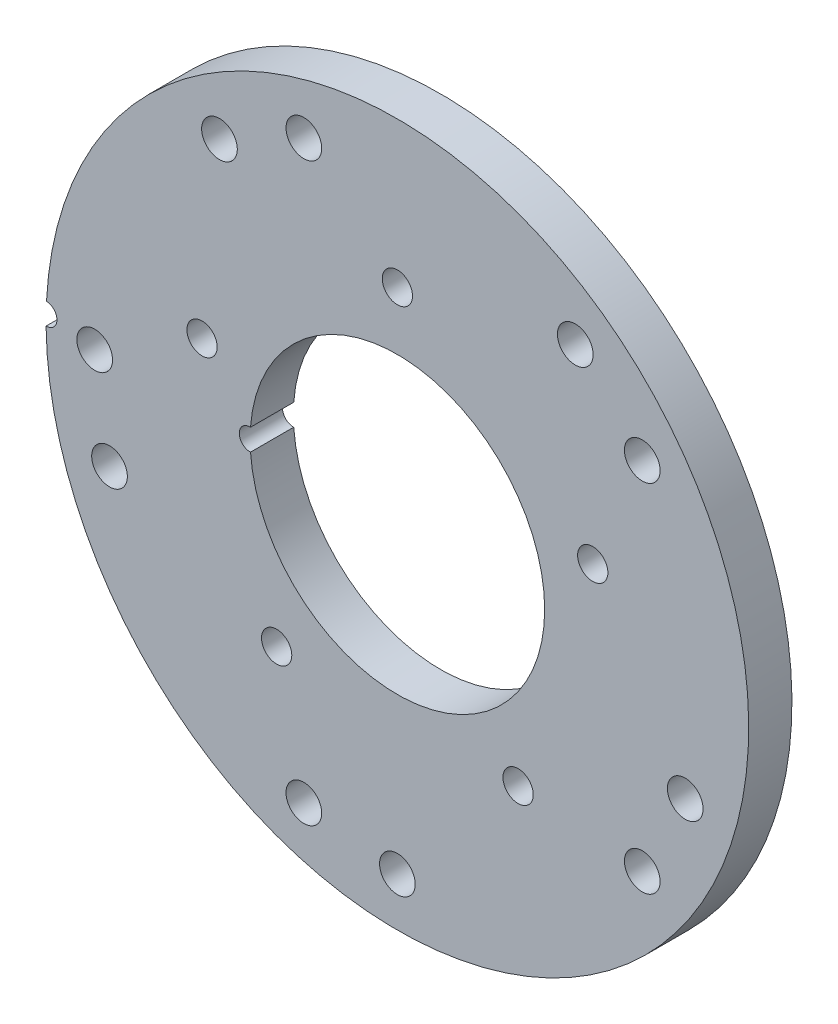
ISO-10303-21;
HEADER;
FILE_DESCRIPTION(('STEP AP214'),'2;1');
FILE_NAME('part.step','',(''),(''),'','','');
FILE_SCHEMA(('AUTOMOTIVE_DESIGN { 1 0 10303 214 1 1 1 1 }'));
ENDSEC;
DATA;
#1=APPLICATION_CONTEXT('core data for automotive mechanical design processes');
#2=APPLICATION_PROTOCOL_DEFINITION('international standard','automotive_design',2000,#1);
#3=PRODUCT_CONTEXT('',#1,'mechanical');
#4=PRODUCT('Part','Part','',(#3));
#5=PRODUCT_RELATED_PRODUCT_CATEGORY('part','',(#4));
#6=PRODUCT_DEFINITION_FORMATION('','',#4);
#7=PRODUCT_DEFINITION_CONTEXT('part definition',#1,'design');
#8=PRODUCT_DEFINITION('design','',#6,#7);
#9=PRODUCT_DEFINITION_SHAPE('','',#8);
#10=(LENGTH_UNIT() NAMED_UNIT(*) SI_UNIT(.MILLI.,.METRE.));
#11=(NAMED_UNIT(*) PLANE_ANGLE_UNIT() SI_UNIT($,.RADIAN.));
#12=(NAMED_UNIT(*) SI_UNIT($,.STERADIAN.) SOLID_ANGLE_UNIT());
#13=UNCERTAINTY_MEASURE_WITH_UNIT(LENGTH_MEASURE(1.E-05),#10,'distance_accuracy_value','');
#14=(GEOMETRIC_REPRESENTATION_CONTEXT(3) GLOBAL_UNCERTAINTY_ASSIGNED_CONTEXT((#13)) GLOBAL_UNIT_ASSIGNED_CONTEXT((#10,
#11,#12)) REPRESENTATION_CONTEXT('',''));
#15=CARTESIAN_POINT('',(0.,0.,0.));
#16=DIRECTION('',(0.,0.,1.));
#17=DIRECTION('',(1.,0.,0.));
#18=AXIS2_PLACEMENT_3D('',#15,#16,#17);
#19=CARTESIAN_POINT('',(0.,0.,4.));
#20=DIRECTION('',(0.,0.,1.));
#21=DIRECTION('',(1.,0.,0.));
#22=AXIS2_PLACEMENT_3D('',#19,#20,#21);
#23=PLANE('',#22);
#24=CARTESIAN_POINT('',(-13.625,0.,4.));
#25=DIRECTION('',(0.,0.,1.));
#26=DIRECTION('',(1.,0.,0.));
#27=AXIS2_PLACEMENT_3D('',#24,#25,#26);
#28=CIRCLE('',#27,1.);
#29=CARTESIAN_POINT('',(-13.5883027522936,0.999326429156548,4.));
#30=VERTEX_POINT('',#29);
#31=CARTESIAN_POINT('',(-13.5883027522936,-0.999326429156548,4.));
#32=VERTEX_POINT('',#31);
#33=EDGE_CURVE('E60',#30,#32,#28,.T.);
#34=ORIENTED_EDGE('',*,*,#33,.F.);
#35=CARTESIAN_POINT('',(0.,0.,4.));
#36=DIRECTION('',(0.,0.,1.));
#37=DIRECTION('',(1.,0.,0.));
#38=AXIS2_PLACEMENT_3D('',#35,#36,#37);
#39=CIRCLE('',#38,13.625);
#40=EDGE_CURVE('E89',#32,#30,#39,.T.);
#41=ORIENTED_EDGE('',*,*,#40,.F.);
#42=EDGE_LOOP('',(#34,#41));
#43=FACE_BOUND('',#42,.T.);
#44=CARTESIAN_POINT('',(-32.4935465104058,0.647638152128651,4.));
#45=DIRECTION('',(0.,0.,1.));
#46=DIRECTION('',(1.,0.,0.));
#47=AXIS2_PLACEMENT_3D('',#44,#45,#46);
#48=CIRCLE('',#47,0.999999999999998);
#49=CARTESIAN_POINT('',(-32.4980899192821,-0.352351526535974,4.));
#50=VERTEX_POINT('',#49);
#51=CARTESIAN_POINT('',(-32.4582399805729,1.64701468224688,4.));
#52=VERTEX_POINT('',#51);
#53=EDGE_CURVE('E90',#50,#52,#48,.T.);
#54=ORIENTED_EDGE('',*,*,#53,.F.);
#55=CARTESIAN_POINT('',(0.,0.,4.));
#56=DIRECTION('',(0.,0.,1.));
#57=DIRECTION('',(1.,0.,0.));
#58=AXIS2_PLACEMENT_3D('',#55,#56,#57);
#59=CIRCLE('',#58,32.5);
#60=EDGE_CURVE('E97',#50,#52,#59,.T.);
#61=ORIENTED_EDGE('',*,*,#60,.T.);
#62=EDGE_LOOP('',(#54,#61));
#63=FACE_BOUND('',#62,.T.);
#64=CARTESIAN_POINT('',(22.6524758424987,16.457987064189,4.));
#65=DIRECTION('',(0.,0.,1.));
#66=DIRECTION('',(1.,0.,0.));
#67=AXIS2_PLACEMENT_3D('',#64,#65,#66);
#68=CIRCLE('',#67,1.65);
#69=CARTESIAN_POINT('',(24.3024758424987,16.457987064189,4.));
#70=VERTEX_POINT('',#69);
#71=EDGE_CURVE('E125',#70,#70,#68,.T.);
#72=ORIENTED_EDGE('',*,*,#71,.F.);
#73=EDGE_LOOP('',(#72));
#74=FACE_BOUND('',#73,.T.);
#75=CARTESIAN_POINT('',(-28.,0.,4.));
#76=DIRECTION('',(0.,0.,1.));
#77=DIRECTION('',(1.,0.,0.));
#78=AXIS2_PLACEMENT_3D('',#75,#76,#77);
#79=CIRCLE('',#78,1.65);
#80=CARTESIAN_POINT('',(-26.35,0.,4.));
#81=VERTEX_POINT('',#80);
#82=EDGE_CURVE('E137',#81,#81,#79,.T.);
#83=ORIENTED_EDGE('',*,*,#82,.F.);
#84=EDGE_LOOP('',(#83));
#85=FACE_BOUND('',#84,.T.);
#86=CARTESIAN_POINT('',(11.1679197935568,-15.3713228931242,4.));
#87=DIRECTION('',(0.,0.,1.));
#88=DIRECTION('',(1.,0.,0.));
#89=AXIS2_PLACEMENT_3D('',#86,#87,#88);
#90=CIRCLE('',#89,1.4);
#91=CARTESIAN_POINT('',(12.5679197935568,-15.3713228931242,4.));
#92=VERTEX_POINT('',#91);
#93=EDGE_CURVE('E149',#92,#92,#90,.T.);
#94=ORIENTED_EDGE('',*,*,#93,.F.);
#95=EDGE_LOOP('',(#94));
#96=FACE_BOUND('',#95,.T.);
#97=CARTESIAN_POINT('',(1.73218085464811E-13,18.9999999999996,4.));
#98=DIRECTION('',(0.,0.,1.));
#99=DIRECTION('',(1.,0.,0.));
#100=AXIS2_PLACEMENT_3D('',#97,#98,#99);
#101=CIRCLE('',#100,1.4);
#102=CARTESIAN_POINT('',(1.40000000000017,18.9999999999996,4.));
#103=VERTEX_POINT('',#102);
#104=EDGE_CURVE('E161',#103,#103,#101,.T.);
#105=ORIENTED_EDGE('',*,*,#104,.F.);
#106=EDGE_LOOP('',(#105));
#107=FACE_BOUND('',#106,.T.);
#108=CARTESIAN_POINT('',(-11.167919793557,-15.371322893124,4.));
#109=DIRECTION('',(0.,0.,1.));
#110=DIRECTION('',(1.,0.,0.));
#111=AXIS2_PLACEMENT_3D('',#108,#109,#110);
#112=CIRCLE('',#111,1.4);
#113=CARTESIAN_POINT('',(-9.76791979355701,-15.371322893124,4.));
#114=VERTEX_POINT('',#113);
#115=EDGE_CURVE('E173',#114,#114,#112,.T.);
#116=ORIENTED_EDGE('',*,*,#115,.F.);
#117=EDGE_LOOP('',(#116));
#118=FACE_BOUND('',#117,.T.);
#119=CARTESIAN_POINT('',(16.4579870641894,22.6524758424984,4.));
#120=DIRECTION('',(0.,0.,1.));
#121=DIRECTION('',(1.,0.,0.));
#122=AXIS2_PLACEMENT_3D('',#119,#120,#121);
#123=CIRCLE('',#122,1.65);
#124=CARTESIAN_POINT('',(18.1079870641894,22.6524758424984,4.));
#125=VERTEX_POINT('',#124);
#126=EDGE_CURVE('E185',#125,#125,#123,.T.);
#127=ORIENTED_EDGE('',*,*,#126,.F.);
#128=EDGE_LOOP('',(#127));
#129=FACE_BOUND('',#128,.T.);
#130=CARTESIAN_POINT('',(-26.6295824562643,-8.65247584249846,4.));
#131=DIRECTION('',(0.,0.,1.));
#132=DIRECTION('',(1.,0.,0.));
#133=AXIS2_PLACEMENT_3D('',#130,#131,#132);
#134=CIRCLE('',#133,1.65);
#135=CARTESIAN_POINT('',(-24.9795824562643,-8.65247584249846,4.));
#136=VERTEX_POINT('',#135);
#137=EDGE_CURVE('E197',#136,#136,#134,.T.);
#138=ORIENTED_EDGE('',*,*,#137,.F.);
#139=EDGE_LOOP('',(#138));
#140=FACE_BOUND('',#139,.T.);
#141=CARTESIAN_POINT('',(0.,-28.,4.));
#142=DIRECTION('',(0.,0.,1.));
#143=DIRECTION('',(1.,0.,0.));
#144=AXIS2_PLACEMENT_3D('',#141,#142,#143);
#145=CIRCLE('',#144,1.65);
#146=CARTESIAN_POINT('',(1.65,-28.,4.));
#147=VERTEX_POINT('',#146);
#148=EDGE_CURVE('E99',#147,#147,#145,.T.);
#149=ORIENTED_EDGE('',*,*,#148,.F.);
#150=EDGE_LOOP('',(#149));
#151=FACE_BOUND('',#150,.T.);
#152=CARTESIAN_POINT('',(-16.4579870641891,22.6524758424986,4.));
#153=DIRECTION('',(0.,0.,1.));
#154=DIRECTION('',(1.,0.,0.));
#155=AXIS2_PLACEMENT_3D('',#152,#153,#154);
#156=CIRCLE('',#155,1.65);
#157=CARTESIAN_POINT('',(-14.8079870641891,22.6524758424986,4.));
#158=VERTEX_POINT('',#157);
#159=EDGE_CURVE('E191',#158,#158,#156,.T.);
#160=ORIENTED_EDGE('',*,*,#159,.F.);
#161=EDGE_LOOP('',(#160));
#162=FACE_BOUND('',#161,.T.);
#163=CARTESIAN_POINT('',(26.6295824562642,-8.65247584249883,4.));
#164=DIRECTION('',(0.,0.,1.));
#165=DIRECTION('',(1.,0.,0.));
#166=AXIS2_PLACEMENT_3D('',#163,#164,#165);
#167=CIRCLE('',#166,1.65);
#168=CARTESIAN_POINT('',(28.2795824562642,-8.65247584249883,4.));
#169=VERTEX_POINT('',#168);
#170=EDGE_CURVE('E179',#169,#169,#167,.T.);
#171=ORIENTED_EDGE('',*,*,#170,.F.);
#172=EDGE_LOOP('',(#171));
#173=FACE_BOUND('',#172,.T.);
#174=CARTESIAN_POINT('',(-18.0700738096077,5.87132289312391,4.));
#175=DIRECTION('',(0.,0.,1.));
#176=DIRECTION('',(1.,0.,0.));
#177=AXIS2_PLACEMENT_3D('',#174,#175,#176);
#178=CIRCLE('',#177,1.4);
#179=CARTESIAN_POINT('',(-16.6700738096077,5.87132289312391,4.));
#180=VERTEX_POINT('',#179);
#181=EDGE_CURVE('E167',#180,#180,#178,.T.);
#182=ORIENTED_EDGE('',*,*,#181,.F.);
#183=EDGE_LOOP('',(#182));
#184=FACE_BOUND('',#183,.T.);
#185=CARTESIAN_POINT('',(18.0700738096078,5.8713228931236,4.));
#186=DIRECTION('',(0.,0.,1.));
#187=DIRECTION('',(1.,0.,0.));
#188=AXIS2_PLACEMENT_3D('',#185,#186,#187);
#189=CIRCLE('',#188,1.4);
#190=CARTESIAN_POINT('',(19.4700738096078,5.8713228931236,4.));
#191=VERTEX_POINT('',#190);
#192=EDGE_CURVE('E155',#191,#191,#189,.T.);
#193=ORIENTED_EDGE('',*,*,#192,.F.);
#194=EDGE_LOOP('',(#193));
#195=FACE_BOUND('',#194,.T.);
#196=CARTESIAN_POINT('',(-8.65247584249855,-26.6295824562643,4.));
#197=DIRECTION('',(0.,0.,1.));
#198=DIRECTION('',(1.,0.,0.));
#199=AXIS2_PLACEMENT_3D('',#196,#197,#198);
#200=CIRCLE('',#199,1.65);
#201=CARTESIAN_POINT('',(-7.00247584249855,-26.6295824562643,4.));
#202=VERTEX_POINT('',#201);
#203=EDGE_CURVE('E143',#202,#202,#200,.T.);
#204=ORIENTED_EDGE('',*,*,#203,.F.);
#205=EDGE_LOOP('',(#204));
#206=FACE_BOUND('',#205,.T.);
#207=CARTESIAN_POINT('',(-8.65247584249836,26.6295824562644,4.));
#208=DIRECTION('',(0.,0.,1.));
#209=DIRECTION('',(1.,0.,0.));
#210=AXIS2_PLACEMENT_3D('',#207,#208,#209);
#211=CIRCLE('',#210,1.65);
#212=CARTESIAN_POINT('',(-7.00247584249836,26.6295824562644,4.));
#213=VERTEX_POINT('',#212);
#214=EDGE_CURVE('E131',#213,#213,#211,.T.);
#215=ORIENTED_EDGE('',*,*,#214,.F.);
#216=EDGE_LOOP('',(#215));
#217=FACE_BOUND('',#216,.T.);
#218=CARTESIAN_POINT('',(22.6524758424983,-16.4579870641895,4.));
#219=DIRECTION('',(0.,0.,1.));
#220=DIRECTION('',(1.,0.,0.));
#221=AXIS2_PLACEMENT_3D('',#218,#219,#220);
#222=CIRCLE('',#221,1.65);
#223=CARTESIAN_POINT('',(24.3024758424983,-16.4579870641895,4.));
#224=VERTEX_POINT('',#223);
#225=EDGE_CURVE('E117',#224,#224,#222,.T.);
#226=ORIENTED_EDGE('',*,*,#225,.F.);
#227=EDGE_LOOP('',(#226));
#228=FACE_BOUND('',#227,.T.);
#229=ADVANCED_FACE('F37',(#43,#63,#74,#85,#96,#107,#118,#129,#140,#151,#162,#173,#184,#195,#206,
#217,#228),#23,.T.);
#230=CARTESIAN_POINT('',(0.,0.,0.));
#231=DIRECTION('',(0.,0.,1.));
#232=DIRECTION('',(1.,0.,0.));
#233=AXIS2_PLACEMENT_3D('',#230,#231,#232);
#234=PLANE('',#233);
#235=CARTESIAN_POINT('',(0.,0.,0.));
#236=DIRECTION('',(0.,0.,1.));
#237=DIRECTION('',(1.,0.,0.));
#238=AXIS2_PLACEMENT_3D('',#235,#236,#237);
#239=CIRCLE('',#238,32.5);
#240=CARTESIAN_POINT('',(-32.4980899192821,-0.352351526535974,0.));
#241=VERTEX_POINT('',#240);
#242=CARTESIAN_POINT('',(-32.4582399805729,1.64701468224705,0.));
#243=VERTEX_POINT('',#242);
#244=EDGE_CURVE('E93',#241,#243,#239,.T.);
#245=ORIENTED_EDGE('',*,*,#244,.F.);
#246=CARTESIAN_POINT('',(-32.4935465104058,0.647638152128651,0.));
#247=DIRECTION('',(0.,0.,1.));
#248=DIRECTION('',(1.,0.,0.));
#249=AXIS2_PLACEMENT_3D('',#246,#247,#248);
#250=CIRCLE('',#249,0.999999999999998);
#251=EDGE_CURVE('E52',#241,#243,#250,.T.);
#252=ORIENTED_EDGE('',*,*,#251,.T.);
#253=EDGE_LOOP('',(#245,#252));
#254=FACE_BOUND('',#253,.T.);
#255=CARTESIAN_POINT('',(0.,0.,0.));
#256=DIRECTION('',(0.,0.,1.));
#257=DIRECTION('',(1.,0.,0.));
#258=AXIS2_PLACEMENT_3D('',#255,#256,#257);
#259=CIRCLE('',#258,13.625);
#260=CARTESIAN_POINT('',(-13.5883027522936,-0.999326429156545,0.));
#261=VERTEX_POINT('',#260);
#262=CARTESIAN_POINT('',(-13.5883027522936,0.999326429156542,0.));
#263=VERTEX_POINT('',#262);
#264=EDGE_CURVE('E94',#261,#263,#259,.T.);
#265=ORIENTED_EDGE('',*,*,#264,.T.);
#266=CARTESIAN_POINT('',(-13.625,0.,0.));
#267=DIRECTION('',(0.,0.,1.));
#268=DIRECTION('',(1.,0.,0.));
#269=AXIS2_PLACEMENT_3D('',#266,#267,#268);
#270=CIRCLE('',#269,1.);
#271=EDGE_CURVE('E79',#263,#261,#270,.T.);
#272=ORIENTED_EDGE('',*,*,#271,.T.);
#273=EDGE_LOOP('',(#265,#272));
#274=FACE_BOUND('',#273,.T.);
#275=CARTESIAN_POINT('',(0.,-28.,0.));
#276=DIRECTION('',(0.,0.,1.));
#277=DIRECTION('',(1.,0.,0.));
#278=AXIS2_PLACEMENT_3D('',#275,#276,#277);
#279=CIRCLE('',#278,1.65);
#280=CARTESIAN_POINT('',(1.65,-28.,0.));
#281=VERTEX_POINT('',#280);
#282=EDGE_CURVE('E102',#281,#281,#279,.T.);
#283=ORIENTED_EDGE('',*,*,#282,.T.);
#284=EDGE_LOOP('',(#283));
#285=FACE_BOUND('',#284,.T.);
#286=CARTESIAN_POINT('',(-26.6295824562643,-8.65247584249846,0.));
#287=DIRECTION('',(0.,0.,1.));
#288=DIRECTION('',(1.,0.,0.));
#289=AXIS2_PLACEMENT_3D('',#286,#287,#288);
#290=CIRCLE('',#289,1.65);
#291=CARTESIAN_POINT('',(-24.9795824562643,-8.65247584249846,0.));
#292=VERTEX_POINT('',#291);
#293=EDGE_CURVE('E194',#292,#292,#290,.T.);
#294=ORIENTED_EDGE('',*,*,#293,.T.);
#295=EDGE_LOOP('',(#294));
#296=FACE_BOUND('',#295,.T.);
#297=CARTESIAN_POINT('',(-16.4579870641891,22.6524758424986,0.));
#298=DIRECTION('',(0.,0.,1.));
#299=DIRECTION('',(1.,0.,0.));
#300=AXIS2_PLACEMENT_3D('',#297,#298,#299);
#301=CIRCLE('',#300,1.65);
#302=CARTESIAN_POINT('',(-14.8079870641891,22.6524758424986,0.));
#303=VERTEX_POINT('',#302);
#304=EDGE_CURVE('E188',#303,#303,#301,.T.);
#305=ORIENTED_EDGE('',*,*,#304,.T.);
#306=EDGE_LOOP('',(#305));
#307=FACE_BOUND('',#306,.T.);
#308=CARTESIAN_POINT('',(16.4579870641894,22.6524758424984,0.));
#309=DIRECTION('',(0.,0.,1.));
#310=DIRECTION('',(1.,0.,0.));
#311=AXIS2_PLACEMENT_3D('',#308,#309,#310);
#312=CIRCLE('',#311,1.65);
#313=CARTESIAN_POINT('',(18.1079870641894,22.6524758424984,0.));
#314=VERTEX_POINT('',#313);
#315=EDGE_CURVE('E182',#314,#314,#312,.T.);
#316=ORIENTED_EDGE('',*,*,#315,.T.);
#317=EDGE_LOOP('',(#316));
#318=FACE_BOUND('',#317,.T.);
#319=CARTESIAN_POINT('',(26.6295824562642,-8.65247584249883,0.));
#320=DIRECTION('',(0.,0.,1.));
#321=DIRECTION('',(1.,0.,0.));
#322=AXIS2_PLACEMENT_3D('',#319,#320,#321);
#323=CIRCLE('',#322,1.65);
#324=CARTESIAN_POINT('',(28.2795824562642,-8.65247584249883,0.));
#325=VERTEX_POINT('',#324);
#326=EDGE_CURVE('E176',#325,#325,#323,.T.);
#327=ORIENTED_EDGE('',*,*,#326,.T.);
#328=EDGE_LOOP('',(#327));
#329=FACE_BOUND('',#328,.T.);
#330=CARTESIAN_POINT('',(-11.167919793557,-15.371322893124,0.));
#331=DIRECTION('',(0.,0.,1.));
#332=DIRECTION('',(1.,0.,0.));
#333=AXIS2_PLACEMENT_3D('',#330,#331,#332);
#334=CIRCLE('',#333,1.4);
#335=CARTESIAN_POINT('',(-9.76791979355701,-15.371322893124,0.));
#336=VERTEX_POINT('',#335);
#337=EDGE_CURVE('E170',#336,#336,#334,.T.);
#338=ORIENTED_EDGE('',*,*,#337,.T.);
#339=EDGE_LOOP('',(#338));
#340=FACE_BOUND('',#339,.T.);
#341=CARTESIAN_POINT('',(-18.0700738096077,5.87132289312391,0.));
#342=DIRECTION('',(0.,0.,1.));
#343=DIRECTION('',(1.,0.,0.));
#344=AXIS2_PLACEMENT_3D('',#341,#342,#343);
#345=CIRCLE('',#344,1.4);
#346=CARTESIAN_POINT('',(-16.6700738096077,5.87132289312391,0.));
#347=VERTEX_POINT('',#346);
#348=EDGE_CURVE('E164',#347,#347,#345,.T.);
#349=ORIENTED_EDGE('',*,*,#348,.T.);
#350=EDGE_LOOP('',(#349));
#351=FACE_BOUND('',#350,.T.);
#352=CARTESIAN_POINT('',(1.73218085464811E-13,18.9999999999996,0.));
#353=DIRECTION('',(0.,0.,1.));
#354=DIRECTION('',(1.,0.,0.));
#355=AXIS2_PLACEMENT_3D('',#352,#353,#354);
#356=CIRCLE('',#355,1.4);
#357=CARTESIAN_POINT('',(1.40000000000017,18.9999999999996,0.));
#358=VERTEX_POINT('',#357);
#359=EDGE_CURVE('E158',#358,#358,#356,.T.);
#360=ORIENTED_EDGE('',*,*,#359,.T.);
#361=EDGE_LOOP('',(#360));
#362=FACE_BOUND('',#361,.T.);
#363=CARTESIAN_POINT('',(18.0700738096078,5.8713228931236,0.));
#364=DIRECTION('',(0.,0.,1.));
#365=DIRECTION('',(1.,0.,0.));
#366=AXIS2_PLACEMENT_3D('',#363,#364,#365);
#367=CIRCLE('',#366,1.4);
#368=CARTESIAN_POINT('',(19.4700738096078,5.8713228931236,0.));
#369=VERTEX_POINT('',#368);
#370=EDGE_CURVE('E152',#369,#369,#367,.T.);
#371=ORIENTED_EDGE('',*,*,#370,.T.);
#372=EDGE_LOOP('',(#371));
#373=FACE_BOUND('',#372,.T.);
#374=CARTESIAN_POINT('',(11.1679197935568,-15.3713228931242,0.));
#375=DIRECTION('',(0.,0.,1.));
#376=DIRECTION('',(1.,0.,0.));
#377=AXIS2_PLACEMENT_3D('',#374,#375,#376);
#378=CIRCLE('',#377,1.4);
#379=CARTESIAN_POINT('',(12.5679197935568,-15.3713228931242,0.));
#380=VERTEX_POINT('',#379);
#381=EDGE_CURVE('E146',#380,#380,#378,.T.);
#382=ORIENTED_EDGE('',*,*,#381,.T.);
#383=EDGE_LOOP('',(#382));
#384=FACE_BOUND('',#383,.T.);
#385=CARTESIAN_POINT('',(-8.65247584249855,-26.6295824562643,0.));
#386=DIRECTION('',(0.,0.,1.));
#387=DIRECTION('',(1.,0.,0.));
#388=AXIS2_PLACEMENT_3D('',#385,#386,#387);
#389=CIRCLE('',#388,1.65);
#390=CARTESIAN_POINT('',(-7.00247584249855,-26.6295824562643,0.));
#391=VERTEX_POINT('',#390);
#392=EDGE_CURVE('E140',#391,#391,#389,.T.);
#393=ORIENTED_EDGE('',*,*,#392,.T.);
#394=EDGE_LOOP('',(#393));
#395=FACE_BOUND('',#394,.T.);
#396=CARTESIAN_POINT('',(-28.,0.,0.));
#397=DIRECTION('',(0.,0.,1.));
#398=DIRECTION('',(1.,0.,0.));
#399=AXIS2_PLACEMENT_3D('',#396,#397,#398);
#400=CIRCLE('',#399,1.65);
#401=CARTESIAN_POINT('',(-26.35,0.,0.));
#402=VERTEX_POINT('',#401);
#403=EDGE_CURVE('E134',#402,#402,#400,.T.);
#404=ORIENTED_EDGE('',*,*,#403,.T.);
#405=EDGE_LOOP('',(#404));
#406=FACE_BOUND('',#405,.T.);
#407=CARTESIAN_POINT('',(-8.65247584249836,26.6295824562644,0.));
#408=DIRECTION('',(0.,0.,1.));
#409=DIRECTION('',(1.,0.,0.));
#410=AXIS2_PLACEMENT_3D('',#407,#408,#409);
#411=CIRCLE('',#410,1.65);
#412=CARTESIAN_POINT('',(-7.00247584249836,26.6295824562644,0.));
#413=VERTEX_POINT('',#412);
#414=EDGE_CURVE('E128',#413,#413,#411,.T.);
#415=ORIENTED_EDGE('',*,*,#414,.T.);
#416=EDGE_LOOP('',(#415));
#417=FACE_BOUND('',#416,.T.);
#418=CARTESIAN_POINT('',(22.6524758424987,16.457987064189,0.));
#419=DIRECTION('',(0.,0.,1.));
#420=DIRECTION('',(1.,0.,0.));
#421=AXIS2_PLACEMENT_3D('',#418,#419,#420);
#422=CIRCLE('',#421,1.65);
#423=CARTESIAN_POINT('',(24.3024758424987,16.457987064189,0.));
#424=VERTEX_POINT('',#423);
#425=EDGE_CURVE('E123',#424,#424,#422,.T.);
#426=ORIENTED_EDGE('',*,*,#425,.T.);
#427=EDGE_LOOP('',(#426));
#428=FACE_BOUND('',#427,.T.);
#429=CARTESIAN_POINT('',(22.6524758424983,-16.4579870641895,0.));
#430=DIRECTION('',(0.,0.,1.));
#431=DIRECTION('',(1.,0.,0.));
#432=AXIS2_PLACEMENT_3D('',#429,#430,#431);
#433=CIRCLE('',#432,1.65);
#434=CARTESIAN_POINT('',(24.3024758424983,-16.4579870641895,0.));
#435=VERTEX_POINT('',#434);
#436=EDGE_CURVE('E114',#435,#435,#433,.T.);
#437=ORIENTED_EDGE('',*,*,#436,.T.);
#438=EDGE_LOOP('',(#437));
#439=FACE_BOUND('',#438,.T.);
#440=ADVANCED_FACE('F112',(#254,#274,#285,#296,#307,#318,#329,#340,#351,#362,#373,#384,#395,
#406,#417,#428,#439),#234,.F.);
#441=CARTESIAN_POINT('',(0.,0.,4.));
#442=DIRECTION('',(0.,0.,-1.));
#443=DIRECTION('',(-1.,0.,0.));
#444=AXIS2_PLACEMENT_3D('',#441,#442,#443);
#445=CYLINDRICAL_SURFACE('',#444,32.5);
#446=ORIENTED_EDGE('',*,*,#244,.T.);
#447=DIRECTION('',(0.,0.,1.));
#448=VECTOR('',#447,1.);
#449=CARTESIAN_POINT('',(-32.4582399805729,1.64701468224688,-1.));
#450=LINE('',#449,#448);
#451=EDGE_CURVE('E11',#243,#52,#450,.T.);
#452=ORIENTED_EDGE('',*,*,#451,.T.);
#453=ORIENTED_EDGE('',*,*,#60,.F.);
#454=DIRECTION('',(0.,0.,1.));
#455=VECTOR('',#454,1.);
#456=CARTESIAN_POINT('',(-32.4980899192821,-0.352351526535974,-1.));
#457=LINE('',#456,#455);
#458=EDGE_CURVE('E45',#50,#241,#457,.F.);
#459=ORIENTED_EDGE('',*,*,#458,.T.);
#460=EDGE_LOOP('',(#446,#452,#453,#459));
#461=FACE_BOUND('',#460,.T.);
#462=ADVANCED_FACE('F39',(#461),#445,.T.);
#463=CARTESIAN_POINT('',(0.,0.,4.));
#464=DIRECTION('',(0.,0.,-1.));
#465=DIRECTION('',(-1.,0.,0.));
#466=AXIS2_PLACEMENT_3D('',#463,#464,#465);
#467=CYLINDRICAL_SURFACE('',#466,13.625);
#468=DIRECTION('',(0.,0.,1.));
#469=VECTOR('',#468,1.);
#470=CARTESIAN_POINT('',(-13.5883027522936,0.999326429156548,-1.));
#471=LINE('',#470,#469);
#472=EDGE_CURVE('E76',#263,#30,#471,.T.);
#473=ORIENTED_EDGE('',*,*,#472,.F.);
#474=ORIENTED_EDGE('',*,*,#264,.F.);
#475=DIRECTION('',(0.,0.,1.));
#476=VECTOR('',#475,1.);
#477=CARTESIAN_POINT('',(-13.5883027522936,-0.999326429156548,-1.));
#478=LINE('',#477,#476);
#479=EDGE_CURVE('E84',#32,#261,#478,.F.);
#480=ORIENTED_EDGE('',*,*,#479,.F.);
#481=ORIENTED_EDGE('',*,*,#40,.T.);
#482=EDGE_LOOP('',(#473,#474,#480,#481));
#483=FACE_BOUND('',#482,.T.);
#484=ADVANCED_FACE('F92',(#483),#467,.F.);
#485=CARTESIAN_POINT('',(0.,-28.,4.));
#486=DIRECTION('',(0.,0.,-1.));
#487=DIRECTION('',(-1.,0.,0.));
#488=AXIS2_PLACEMENT_3D('',#485,#486,#487);
#489=CYLINDRICAL_SURFACE('',#488,1.65);
#490=ORIENTED_EDGE('',*,*,#148,.T.);
#491=EDGE_LOOP('',(#490));
#492=FACE_BOUND('',#491,.T.);
#493=ORIENTED_EDGE('',*,*,#282,.F.);
#494=EDGE_LOOP('',(#493));
#495=FACE_BOUND('',#494,.T.);
#496=ADVANCED_FACE('F209',(#492,#495),#489,.F.);
#497=CARTESIAN_POINT('',(-26.6295824562643,-8.65247584249846,4.));
#498=DIRECTION('',(0.,0.,-1.));
#499=DIRECTION('',(-1.,0.,0.));
#500=AXIS2_PLACEMENT_3D('',#497,#498,#499);
#501=CYLINDRICAL_SURFACE('',#500,1.65);
#502=ORIENTED_EDGE('',*,*,#137,.T.);
#503=EDGE_LOOP('',(#502));
#504=FACE_BOUND('',#503,.T.);
#505=ORIENTED_EDGE('',*,*,#293,.F.);
#506=EDGE_LOOP('',(#505));
#507=FACE_BOUND('',#506,.T.);
#508=ADVANCED_FACE('F211',(#504,#507),#501,.F.);
#509=CARTESIAN_POINT('',(-16.4579870641891,22.6524758424986,4.));
#510=DIRECTION('',(0.,0.,-1.));
#511=DIRECTION('',(-1.,0.,0.));
#512=AXIS2_PLACEMENT_3D('',#509,#510,#511);
#513=CYLINDRICAL_SURFACE('',#512,1.65);
#514=ORIENTED_EDGE('',*,*,#159,.T.);
#515=EDGE_LOOP('',(#514));
#516=FACE_BOUND('',#515,.T.);
#517=ORIENTED_EDGE('',*,*,#304,.F.);
#518=EDGE_LOOP('',(#517));
#519=FACE_BOUND('',#518,.T.);
#520=ADVANCED_FACE('F217',(#516,#519),#513,.F.);
#521=CARTESIAN_POINT('',(16.4579870641894,22.6524758424984,4.));
#522=DIRECTION('',(0.,0.,-1.));
#523=DIRECTION('',(-1.,0.,0.));
#524=AXIS2_PLACEMENT_3D('',#521,#522,#523);
#525=CYLINDRICAL_SURFACE('',#524,1.65);
#526=ORIENTED_EDGE('',*,*,#126,.T.);
#527=EDGE_LOOP('',(#526));
#528=FACE_BOUND('',#527,.T.);
#529=ORIENTED_EDGE('',*,*,#315,.F.);
#530=EDGE_LOOP('',(#529));
#531=FACE_BOUND('',#530,.T.);
#532=ADVANCED_FACE('F302',(#528,#531),#525,.F.);
#533=CARTESIAN_POINT('',(26.6295824562642,-8.65247584249883,4.));
#534=DIRECTION('',(0.,0.,-1.));
#535=DIRECTION('',(-1.,0.,0.));
#536=AXIS2_PLACEMENT_3D('',#533,#534,#535);
#537=CYLINDRICAL_SURFACE('',#536,1.65);
#538=ORIENTED_EDGE('',*,*,#170,.T.);
#539=EDGE_LOOP('',(#538));
#540=FACE_BOUND('',#539,.T.);
#541=ORIENTED_EDGE('',*,*,#326,.F.);
#542=EDGE_LOOP('',(#541));
#543=FACE_BOUND('',#542,.T.);
#544=ADVANCED_FACE('F298',(#540,#543),#537,.F.);
#545=CARTESIAN_POINT('',(-11.167919793557,-15.371322893124,4.));
#546=DIRECTION('',(0.,0.,-1.));
#547=DIRECTION('',(-1.,0.,0.));
#548=AXIS2_PLACEMENT_3D('',#545,#546,#547);
#549=CYLINDRICAL_SURFACE('',#548,1.4);
#550=ORIENTED_EDGE('',*,*,#115,.T.);
#551=EDGE_LOOP('',(#550));
#552=FACE_BOUND('',#551,.T.);
#553=ORIENTED_EDGE('',*,*,#337,.F.);
#554=EDGE_LOOP('',(#553));
#555=FACE_BOUND('',#554,.T.);
#556=ADVANCED_FACE('F294',(#552,#555),#549,.F.);
#557=CARTESIAN_POINT('',(-18.0700738096077,5.87132289312391,4.));
#558=DIRECTION('',(0.,0.,-1.));
#559=DIRECTION('',(-1.,0.,0.));
#560=AXIS2_PLACEMENT_3D('',#557,#558,#559);
#561=CYLINDRICAL_SURFACE('',#560,1.4);
#562=ORIENTED_EDGE('',*,*,#181,.T.);
#563=EDGE_LOOP('',(#562));
#564=FACE_BOUND('',#563,.T.);
#565=ORIENTED_EDGE('',*,*,#348,.F.);
#566=EDGE_LOOP('',(#565));
#567=FACE_BOUND('',#566,.T.);
#568=ADVANCED_FACE('F290',(#564,#567),#561,.F.);
#569=CARTESIAN_POINT('',(1.73218085464811E-13,18.9999999999996,4.));
#570=DIRECTION('',(0.,0.,-1.));
#571=DIRECTION('',(-1.,0.,0.));
#572=AXIS2_PLACEMENT_3D('',#569,#570,#571);
#573=CYLINDRICAL_SURFACE('',#572,1.4);
#574=ORIENTED_EDGE('',*,*,#104,.T.);
#575=EDGE_LOOP('',(#574));
#576=FACE_BOUND('',#575,.T.);
#577=ORIENTED_EDGE('',*,*,#359,.F.);
#578=EDGE_LOOP('',(#577));
#579=FACE_BOUND('',#578,.T.);
#580=ADVANCED_FACE('F286',(#576,#579),#573,.F.);
#581=CARTESIAN_POINT('',(18.0700738096078,5.8713228931236,4.));
#582=DIRECTION('',(0.,0.,-1.));
#583=DIRECTION('',(-1.,0.,0.));
#584=AXIS2_PLACEMENT_3D('',#581,#582,#583);
#585=CYLINDRICAL_SURFACE('',#584,1.4);
#586=ORIENTED_EDGE('',*,*,#192,.T.);
#587=EDGE_LOOP('',(#586));
#588=FACE_BOUND('',#587,.T.);
#589=ORIENTED_EDGE('',*,*,#370,.F.);
#590=EDGE_LOOP('',(#589));
#591=FACE_BOUND('',#590,.T.);
#592=ADVANCED_FACE('F282',(#588,#591),#585,.F.);
#593=CARTESIAN_POINT('',(11.1679197935568,-15.3713228931242,4.));
#594=DIRECTION('',(0.,0.,-1.));
#595=DIRECTION('',(-1.,0.,0.));
#596=AXIS2_PLACEMENT_3D('',#593,#594,#595);
#597=CYLINDRICAL_SURFACE('',#596,1.4);
#598=ORIENTED_EDGE('',*,*,#93,.T.);
#599=EDGE_LOOP('',(#598));
#600=FACE_BOUND('',#599,.T.);
#601=ORIENTED_EDGE('',*,*,#381,.F.);
#602=EDGE_LOOP('',(#601));
#603=FACE_BOUND('',#602,.T.);
#604=ADVANCED_FACE('F278',(#600,#603),#597,.F.);
#605=CARTESIAN_POINT('',(-8.65247584249855,-26.6295824562643,4.));
#606=DIRECTION('',(0.,0.,-1.));
#607=DIRECTION('',(-1.,0.,0.));
#608=AXIS2_PLACEMENT_3D('',#605,#606,#607);
#609=CYLINDRICAL_SURFACE('',#608,1.65);
#610=ORIENTED_EDGE('',*,*,#203,.T.);
#611=EDGE_LOOP('',(#610));
#612=FACE_BOUND('',#611,.T.);
#613=ORIENTED_EDGE('',*,*,#392,.F.);
#614=EDGE_LOOP('',(#613));
#615=FACE_BOUND('',#614,.T.);
#616=ADVANCED_FACE('F274',(#612,#615),#609,.F.);
#617=CARTESIAN_POINT('',(-28.,0.,4.));
#618=DIRECTION('',(0.,0.,-1.));
#619=DIRECTION('',(-1.,0.,0.));
#620=AXIS2_PLACEMENT_3D('',#617,#618,#619);
#621=CYLINDRICAL_SURFACE('',#620,1.65);
#622=ORIENTED_EDGE('',*,*,#82,.T.);
#623=EDGE_LOOP('',(#622));
#624=FACE_BOUND('',#623,.T.);
#625=ORIENTED_EDGE('',*,*,#403,.F.);
#626=EDGE_LOOP('',(#625));
#627=FACE_BOUND('',#626,.T.);
#628=ADVANCED_FACE('F270',(#624,#627),#621,.F.);
#629=CARTESIAN_POINT('',(-8.65247584249836,26.6295824562644,4.));
#630=DIRECTION('',(0.,0.,-1.));
#631=DIRECTION('',(-1.,0.,0.));
#632=AXIS2_PLACEMENT_3D('',#629,#630,#631);
#633=CYLINDRICAL_SURFACE('',#632,1.65);
#634=ORIENTED_EDGE('',*,*,#214,.T.);
#635=EDGE_LOOP('',(#634));
#636=FACE_BOUND('',#635,.T.);
#637=ORIENTED_EDGE('',*,*,#414,.F.);
#638=EDGE_LOOP('',(#637));
#639=FACE_BOUND('',#638,.T.);
#640=ADVANCED_FACE('F266',(#636,#639),#633,.F.);
#641=CARTESIAN_POINT('',(22.6524758424987,16.457987064189,4.));
#642=DIRECTION('',(0.,0.,-1.));
#643=DIRECTION('',(-1.,0.,0.));
#644=AXIS2_PLACEMENT_3D('',#641,#642,#643);
#645=CYLINDRICAL_SURFACE('',#644,1.65);
#646=ORIENTED_EDGE('',*,*,#71,.T.);
#647=EDGE_LOOP('',(#646));
#648=FACE_BOUND('',#647,.T.);
#649=ORIENTED_EDGE('',*,*,#425,.F.);
#650=EDGE_LOOP('',(#649));
#651=FACE_BOUND('',#650,.T.);
#652=ADVANCED_FACE('F262',(#648,#651),#645,.F.);
#653=CARTESIAN_POINT('',(22.6524758424983,-16.4579870641895,4.));
#654=DIRECTION('',(0.,0.,-1.));
#655=DIRECTION('',(-1.,0.,0.));
#656=AXIS2_PLACEMENT_3D('',#653,#654,#655);
#657=CYLINDRICAL_SURFACE('',#656,1.65);
#658=ORIENTED_EDGE('',*,*,#225,.T.);
#659=EDGE_LOOP('',(#658));
#660=FACE_BOUND('',#659,.T.);
#661=ORIENTED_EDGE('',*,*,#436,.F.);
#662=EDGE_LOOP('',(#661));
#663=FACE_BOUND('',#662,.T.);
#664=ADVANCED_FACE('F246',(#660,#663),#657,.F.);
#665=CARTESIAN_POINT('',(-13.625,0.,-6.));
#666=DIRECTION('',(0.,0.,1.));
#667=DIRECTION('',(1.,0.,0.));
#668=AXIS2_PLACEMENT_3D('',#665,#666,#667);
#669=CYLINDRICAL_SURFACE('',#668,1.);
#670=ORIENTED_EDGE('',*,*,#472,.T.);
#671=ORIENTED_EDGE('',*,*,#33,.T.);
#672=ORIENTED_EDGE('',*,*,#479,.T.);
#673=ORIENTED_EDGE('',*,*,#271,.F.);
#674=EDGE_LOOP('',(#670,#671,#672,#673));
#675=FACE_BOUND('',#674,.T.);
#676=ADVANCED_FACE('F77',(#675),#669,.F.);
#677=CARTESIAN_POINT('',(-32.4935465104058,0.647638152128651,-6.));
#678=DIRECTION('',(0.,0.,1.));
#679=DIRECTION('',(1.,0.,0.));
#680=AXIS2_PLACEMENT_3D('',#677,#678,#679);
#681=CYLINDRICAL_SURFACE('',#680,0.999999999999998);
#682=ORIENTED_EDGE('',*,*,#251,.F.);
#683=ORIENTED_EDGE('',*,*,#458,.F.);
#684=ORIENTED_EDGE('',*,*,#53,.T.);
#685=ORIENTED_EDGE('',*,*,#451,.F.);
#686=EDGE_LOOP('',(#682,#683,#684,#685));
#687=FACE_BOUND('',#686,.T.);
#688=ADVANCED_FACE('F245',(#687),#681,.F.);
#689=CLOSED_SHELL('',(#229,#440,#462,#484,#496,#508,#520,#532,#544,#556,#568,#580,#592,#604,
#616,#628,#640,#652,#664,#676,#688));
#690=MANIFOLD_SOLID_BREP('B2',#689);
#691=ADVANCED_BREP_SHAPE_REPRESENTATION('',(#18,#690),#14);
#692=SHAPE_DEFINITION_REPRESENTATION(#9,#691);
ENDSEC;
END-ISO-10303-21;
